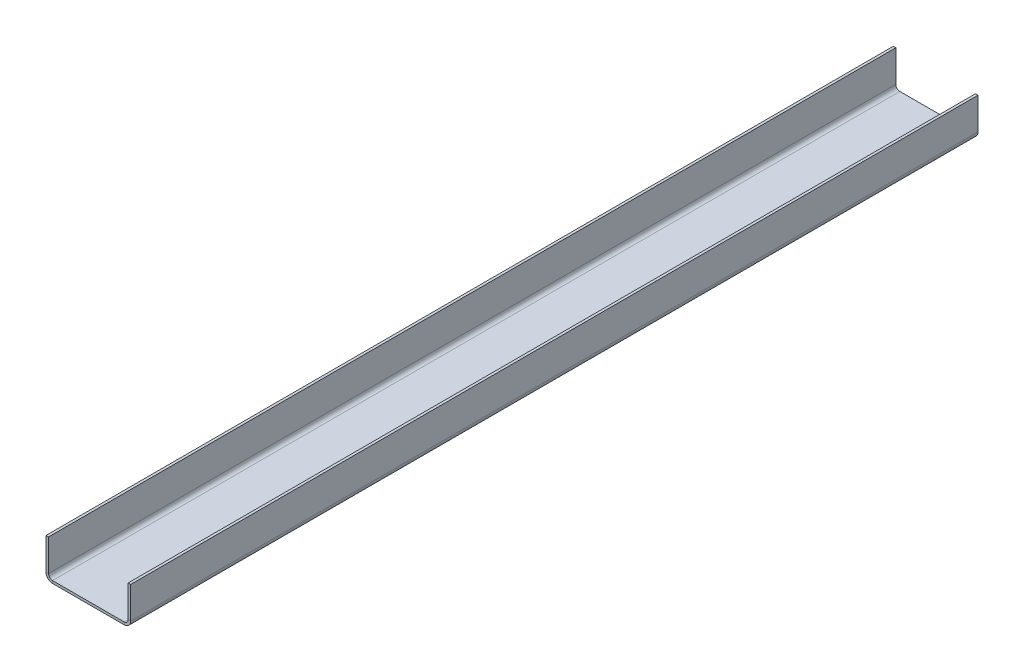
ISO-10303-21;
HEADER;
FILE_DESCRIPTION(('STEP AP214'),'2;1');
FILE_NAME('part.step','',(''),(''),'','','');
FILE_SCHEMA(('AUTOMOTIVE_DESIGN { 1 0 10303 214 1 1 1 1 }'));
ENDSEC;
DATA;
#1=APPLICATION_CONTEXT('core data for automotive mechanical design processes');
#2=APPLICATION_PROTOCOL_DEFINITION('international standard','automotive_design',2000,#1);
#3=PRODUCT_CONTEXT('',#1,'mechanical');
#4=PRODUCT('Part','Part','',(#3));
#5=PRODUCT_RELATED_PRODUCT_CATEGORY('part','',(#4));
#6=PRODUCT_DEFINITION_FORMATION('','',#4);
#7=PRODUCT_DEFINITION_CONTEXT('part definition',#1,'design');
#8=PRODUCT_DEFINITION('design','',#6,#7);
#9=PRODUCT_DEFINITION_SHAPE('','',#8);
#10=(LENGTH_UNIT() NAMED_UNIT(*) SI_UNIT(.MILLI.,.METRE.));
#11=(NAMED_UNIT(*) PLANE_ANGLE_UNIT() SI_UNIT($,.RADIAN.));
#12=(NAMED_UNIT(*) SI_UNIT($,.STERADIAN.) SOLID_ANGLE_UNIT());
#13=UNCERTAINTY_MEASURE_WITH_UNIT(LENGTH_MEASURE(1.E-05),#10,'distance_accuracy_value','');
#14=(GEOMETRIC_REPRESENTATION_CONTEXT(3) GLOBAL_UNCERTAINTY_ASSIGNED_CONTEXT((#13)) GLOBAL_UNIT_ASSIGNED_CONTEXT((#10,
#11,#12)) REPRESENTATION_CONTEXT('',''));
#15=CARTESIAN_POINT('',(0.,0.,0.));
#16=DIRECTION('',(0.,0.,1.));
#17=DIRECTION('',(1.,0.,0.));
#18=AXIS2_PLACEMENT_3D('',#15,#16,#17);
#19=CARTESIAN_POINT('',(0.,3.25,420.));
#20=DIRECTION('',(0.,0.,1.));
#21=DIRECTION('',(1.,0.,0.));
#22=AXIS2_PLACEMENT_3D('',#19,#20,#21);
#23=PLANE('',#22);
#24=DIRECTION('',(1.,0.,0.));
#25=VECTOR('',#24,1.);
#26=CARTESIAN_POINT('',(0.,3.25,420.));
#27=LINE('',#26,#25);
#28=CARTESIAN_POINT('',(0.,3.25,420.));
#29=VERTEX_POINT('',#28);
#30=CARTESIAN_POINT('',(1.25,3.25,420.));
#31=VERTEX_POINT('',#30);
#32=EDGE_CURVE('E11',#29,#31,#27,.T.);
#33=ORIENTED_EDGE('',*,*,#32,.F.);
#34=CARTESIAN_POINT('',(3.25,3.25,420.));
#35=DIRECTION('',(0.,0.,-1.));
#36=DIRECTION('',(-1.,0.,0.));
#37=AXIS2_PLACEMENT_3D('',#34,#35,#36);
#38=CIRCLE('',#37,3.25);
#39=CARTESIAN_POINT('',(3.25,0.,420.));
#40=VERTEX_POINT('',#39);
#41=EDGE_CURVE('E146',#29,#40,#38,.F.);
#42=ORIENTED_EDGE('',*,*,#41,.T.);
#43=DIRECTION('',(0.,-1.,0.));
#44=VECTOR('',#43,1.);
#45=CARTESIAN_POINT('',(3.25,1.25,420.));
#46=LINE('',#45,#44);
#47=CARTESIAN_POINT('',(3.25,1.25,420.));
#48=VERTEX_POINT('',#47);
#49=EDGE_CURVE('E44',#48,#40,#46,.T.);
#50=ORIENTED_EDGE('',*,*,#49,.F.);
#51=CARTESIAN_POINT('',(3.25,3.25,420.));
#52=DIRECTION('',(0.,0.,1.));
#53=DIRECTION('',(1.,0.,0.));
#54=AXIS2_PLACEMENT_3D('',#51,#52,#53);
#55=CIRCLE('',#54,2.);
#56=EDGE_CURVE('E240',#31,#48,#55,.T.);
#57=ORIENTED_EDGE('',*,*,#56,.F.);
#58=EDGE_LOOP('',(#33,#42,#50,#57));
#59=FACE_BOUND('',#58,.T.);
#60=ADVANCED_FACE('F36',(#59),#23,.T.);
#61=CARTESIAN_POINT('',(3.25,1.25,420.));
#62=DIRECTION('',(0.,0.,1.));
#63=DIRECTION('',(1.,0.,0.));
#64=AXIS2_PLACEMENT_3D('',#61,#62,#63);
#65=PLANE('',#64);
#66=DIRECTION('',(0.,-1.,0.));
#67=VECTOR('',#66,1.);
#68=CARTESIAN_POINT('',(0.,19.,420.));
#69=LINE('',#68,#67);
#70=CARTESIAN_POINT('',(0.,19.,420.));
#71=VERTEX_POINT('',#70);
#72=EDGE_CURVE('E151',#71,#29,#69,.T.);
#73=ORIENTED_EDGE('',*,*,#72,.T.);
#74=ORIENTED_EDGE('',*,*,#32,.T.);
#75=DIRECTION('',(0.,-1.,0.));
#76=VECTOR('',#75,1.);
#77=CARTESIAN_POINT('',(1.25,19.,420.));
#78=LINE('',#77,#76);
#79=CARTESIAN_POINT('',(1.25,19.,420.));
#80=VERTEX_POINT('',#79);
#81=EDGE_CURVE('E253',#80,#31,#78,.T.);
#82=ORIENTED_EDGE('',*,*,#81,.F.);
#83=DIRECTION('',(1.,0.,0.));
#84=VECTOR('',#83,1.);
#85=CARTESIAN_POINT('',(0.,19.,420.));
#86=LINE('',#85,#84);
#87=EDGE_CURVE('E255',#71,#80,#86,.T.);
#88=ORIENTED_EDGE('',*,*,#87,.F.);
#89=EDGE_LOOP('',(#73,#74,#82,#88));
#90=FACE_BOUND('',#89,.T.);
#91=ADVANCED_FACE('F266',(#90),#65,.T.);
#92=CARTESIAN_POINT('',(3.25,0.,0.));
#93=DIRECTION('',(0.,0.,-1.));
#94=DIRECTION('',(-1.,0.,0.));
#95=AXIS2_PLACEMENT_3D('',#92,#93,#94);
#96=PLANE('',#95);
#97=DIRECTION('',(0.,1.,0.));
#98=VECTOR('',#97,1.);
#99=CARTESIAN_POINT('',(3.25,0.,0.));
#100=LINE('',#99,#98);
#101=CARTESIAN_POINT('',(3.25,0.,0.));
#102=VERTEX_POINT('',#101);
#103=CARTESIAN_POINT('',(3.25,1.25,0.));
#104=VERTEX_POINT('',#103);
#105=EDGE_CURVE('E144',#102,#104,#100,.T.);
#106=ORIENTED_EDGE('',*,*,#105,.F.);
#107=CARTESIAN_POINT('',(3.25,3.25,0.));
#108=DIRECTION('',(0.,0.,-1.));
#109=DIRECTION('',(-1.,0.,0.));
#110=AXIS2_PLACEMENT_3D('',#107,#108,#109);
#111=CIRCLE('',#110,3.25);
#112=CARTESIAN_POINT('',(0.,3.25,0.));
#113=VERTEX_POINT('',#112);
#114=EDGE_CURVE('E158',#113,#102,#111,.F.);
#115=ORIENTED_EDGE('',*,*,#114,.F.);
#116=DIRECTION('',(-1.,0.,0.));
#117=VECTOR('',#116,1.);
#118=CARTESIAN_POINT('',(1.25,3.25,0.));
#119=LINE('',#118,#117);
#120=CARTESIAN_POINT('',(1.25,3.25,0.));
#121=VERTEX_POINT('',#120);
#122=EDGE_CURVE('E231',#121,#113,#119,.T.);
#123=ORIENTED_EDGE('',*,*,#122,.F.);
#124=CARTESIAN_POINT('',(3.25,3.25,0.));
#125=DIRECTION('',(0.,0.,1.));
#126=DIRECTION('',(1.,0.,0.));
#127=AXIS2_PLACEMENT_3D('',#124,#125,#126);
#128=CIRCLE('',#127,2.);
#129=EDGE_CURVE('E185',#121,#104,#128,.T.);
#130=ORIENTED_EDGE('',*,*,#129,.T.);
#131=EDGE_LOOP('',(#106,#115,#123,#130));
#132=FACE_BOUND('',#131,.T.);
#133=ADVANCED_FACE('F245',(#132),#96,.T.);
#134=CARTESIAN_POINT('',(1.25,3.25,0.));
#135=DIRECTION('',(0.,0.,-1.));
#136=DIRECTION('',(-1.,0.,0.));
#137=AXIS2_PLACEMENT_3D('',#134,#135,#136);
#138=PLANE('',#137);
#139=DIRECTION('',(1.,0.,0.));
#140=VECTOR('',#139,1.);
#141=CARTESIAN_POINT('',(0.,0.,0.));
#142=LINE('',#141,#140);
#143=CARTESIAN_POINT('',(38.75,0.,0.));
#144=VERTEX_POINT('',#143);
#145=EDGE_CURVE('E198',#102,#144,#142,.T.);
#146=ORIENTED_EDGE('',*,*,#145,.F.);
#147=ORIENTED_EDGE('',*,*,#105,.T.);
#148=DIRECTION('',(1.,0.,0.));
#149=VECTOR('',#148,1.);
#150=CARTESIAN_POINT('',(0.,1.25,0.));
#151=LINE('',#150,#149);
#152=CARTESIAN_POINT('',(38.75,1.25,0.));
#153=VERTEX_POINT('',#152);
#154=EDGE_CURVE('E183',#104,#153,#151,.T.);
#155=ORIENTED_EDGE('',*,*,#154,.T.);
#156=DIRECTION('',(0.,-1.,0.));
#157=VECTOR('',#156,1.);
#158=CARTESIAN_POINT('',(38.75,1.25,0.));
#159=LINE('',#158,#157);
#160=EDGE_CURVE('E93',#153,#144,#159,.T.);
#161=ORIENTED_EDGE('',*,*,#160,.T.);
#162=EDGE_LOOP('',(#146,#147,#155,#161));
#163=FACE_BOUND('',#162,.T.);
#164=ADVANCED_FACE('F233',(#163),#138,.T.);
#165=CARTESIAN_POINT('',(38.75,0.,420.));
#166=DIRECTION('',(0.,0.,1.));
#167=DIRECTION('',(1.,0.,0.));
#168=AXIS2_PLACEMENT_3D('',#165,#166,#167);
#169=PLANE('',#168);
#170=DIRECTION('',(0.,1.,0.));
#171=VECTOR('',#170,1.);
#172=CARTESIAN_POINT('',(38.75,0.,420.));
#173=LINE('',#172,#171);
#174=CARTESIAN_POINT('',(38.75,0.,420.));
#175=VERTEX_POINT('',#174);
#176=CARTESIAN_POINT('',(38.75,1.25,420.));
#177=VERTEX_POINT('',#176);
#178=EDGE_CURVE('E229',#175,#177,#173,.T.);
#179=ORIENTED_EDGE('',*,*,#178,.F.);
#180=CARTESIAN_POINT('',(38.75,3.25,420.));
#181=DIRECTION('',(0.,0.,-1.));
#182=DIRECTION('',(-1.,0.,0.));
#183=AXIS2_PLACEMENT_3D('',#180,#181,#182);
#184=CIRCLE('',#183,3.25);
#185=CARTESIAN_POINT('',(42.,3.25,420.));
#186=VERTEX_POINT('',#185);
#187=EDGE_CURVE('E166',#175,#186,#184,.F.);
#188=ORIENTED_EDGE('',*,*,#187,.T.);
#189=DIRECTION('',(1.,0.,0.));
#190=VECTOR('',#189,1.);
#191=CARTESIAN_POINT('',(40.75,3.25,420.));
#192=LINE('',#191,#190);
#193=CARTESIAN_POINT('',(40.75,3.25,420.));
#194=VERTEX_POINT('',#193);
#195=EDGE_CURVE('E52',#194,#186,#192,.T.);
#196=ORIENTED_EDGE('',*,*,#195,.F.);
#197=CARTESIAN_POINT('',(38.75,3.25,420.));
#198=DIRECTION('',(0.,0.,1.));
#199=DIRECTION('',(1.,0.,0.));
#200=AXIS2_PLACEMENT_3D('',#197,#198,#199);
#201=CIRCLE('',#200,2.);
#202=EDGE_CURVE('E257',#177,#194,#201,.T.);
#203=ORIENTED_EDGE('',*,*,#202,.F.);
#204=EDGE_LOOP('',(#179,#188,#196,#203));
#205=FACE_BOUND('',#204,.T.);
#206=ADVANCED_FACE('F292',(#205),#169,.T.);
#207=CARTESIAN_POINT('',(40.75,3.25,420.));
#208=DIRECTION('',(0.,0.,1.));
#209=DIRECTION('',(1.,0.,0.));
#210=AXIS2_PLACEMENT_3D('',#207,#208,#209);
#211=PLANE('',#210);
#212=DIRECTION('',(1.,0.,0.));
#213=VECTOR('',#212,1.);
#214=CARTESIAN_POINT('',(0.,0.,420.));
#215=LINE('',#214,#213);
#216=EDGE_CURVE('E136',#40,#175,#215,.T.);
#217=ORIENTED_EDGE('',*,*,#216,.T.);
#218=ORIENTED_EDGE('',*,*,#178,.T.);
#219=DIRECTION('',(1.,0.,0.));
#220=VECTOR('',#219,1.);
#221=CARTESIAN_POINT('',(0.,1.25,420.));
#222=LINE('',#221,#220);
#223=EDGE_CURVE('E139',#48,#177,#222,.T.);
#224=ORIENTED_EDGE('',*,*,#223,.F.);
#225=ORIENTED_EDGE('',*,*,#49,.T.);
#226=EDGE_LOOP('',(#217,#218,#224,#225));
#227=FACE_BOUND('',#226,.T.);
#228=ADVANCED_FACE('F134',(#227),#211,.T.);
#229=CARTESIAN_POINT('',(42.,3.25,0.));
#230=DIRECTION('',(0.,0.,-1.));
#231=DIRECTION('',(-1.,0.,0.));
#232=AXIS2_PLACEMENT_3D('',#229,#230,#231);
#233=PLANE('',#232);
#234=DIRECTION('',(-1.,0.,0.));
#235=VECTOR('',#234,1.);
#236=CARTESIAN_POINT('',(42.,3.25,0.));
#237=LINE('',#236,#235);
#238=CARTESIAN_POINT('',(42.,3.25,0.));
#239=VERTEX_POINT('',#238);
#240=CARTESIAN_POINT('',(40.75,3.25,0.));
#241=VERTEX_POINT('',#240);
#242=EDGE_CURVE('E100',#239,#241,#237,.T.);
#243=ORIENTED_EDGE('',*,*,#242,.F.);
#244=CARTESIAN_POINT('',(38.75,3.25,0.));
#245=DIRECTION('',(0.,0.,-1.));
#246=DIRECTION('',(-1.,0.,0.));
#247=AXIS2_PLACEMENT_3D('',#244,#245,#246);
#248=CIRCLE('',#247,3.25);
#249=EDGE_CURVE('E200',#144,#239,#248,.F.);
#250=ORIENTED_EDGE('',*,*,#249,.F.);
#251=ORIENTED_EDGE('',*,*,#160,.F.);
#252=CARTESIAN_POINT('',(38.75,3.25,0.));
#253=DIRECTION('',(0.,0.,1.));
#254=DIRECTION('',(1.,0.,0.));
#255=AXIS2_PLACEMENT_3D('',#252,#253,#254);
#256=CIRCLE('',#255,2.);
#257=EDGE_CURVE('E181',#153,#241,#256,.T.);
#258=ORIENTED_EDGE('',*,*,#257,.T.);
#259=EDGE_LOOP('',(#243,#250,#251,#258));
#260=FACE_BOUND('',#259,.T.);
#261=ADVANCED_FACE('F298',(#260),#233,.T.);
#262=CARTESIAN_POINT('',(38.75,1.25,0.));
#263=DIRECTION('',(0.,0.,-1.));
#264=DIRECTION('',(-1.,0.,0.));
#265=AXIS2_PLACEMENT_3D('',#262,#263,#264);
#266=PLANE('',#265);
#267=DIRECTION('',(0.,1.,0.));
#268=VECTOR('',#267,1.);
#269=CARTESIAN_POINT('',(42.,0.,0.));
#270=LINE('',#269,#268);
#271=CARTESIAN_POINT('',(42.,19.,0.));
#272=VERTEX_POINT('',#271);
#273=EDGE_CURVE('E172',#239,#272,#270,.T.);
#274=ORIENTED_EDGE('',*,*,#273,.F.);
#275=ORIENTED_EDGE('',*,*,#242,.T.);
#276=DIRECTION('',(0.,1.,0.));
#277=VECTOR('',#276,1.);
#278=CARTESIAN_POINT('',(40.75,0.,0.));
#279=LINE('',#278,#277);
#280=CARTESIAN_POINT('',(40.75,19.,0.));
#281=VERTEX_POINT('',#280);
#282=EDGE_CURVE('E178',#241,#281,#279,.T.);
#283=ORIENTED_EDGE('',*,*,#282,.T.);
#284=DIRECTION('',(1.,0.,0.));
#285=VECTOR('',#284,1.);
#286=CARTESIAN_POINT('',(40.75,19.,0.));
#287=LINE('',#286,#285);
#288=EDGE_CURVE('E175',#281,#272,#287,.T.);
#289=ORIENTED_EDGE('',*,*,#288,.T.);
#290=EDGE_LOOP('',(#274,#275,#283,#289));
#291=FACE_BOUND('',#290,.T.);
#292=ADVANCED_FACE('F301',(#291),#266,.T.);
#293=CARTESIAN_POINT('',(42.,0.,420.));
#294=DIRECTION('',(-1.,0.,0.));
#295=DIRECTION('',(0.,0.,1.));
#296=AXIS2_PLACEMENT_3D('',#293,#294,#295);
#297=PLANE('',#296);
#298=ORIENTED_EDGE('',*,*,#273,.T.);
#299=DIRECTION('',(0.,0.,-1.));
#300=VECTOR('',#299,1.);
#301=CARTESIAN_POINT('',(42.,19.,420.));
#302=LINE('',#301,#300);
#303=CARTESIAN_POINT('',(42.,19.,420.));
#304=VERTEX_POINT('',#303);
#305=EDGE_CURVE('E224',#304,#272,#302,.T.);
#306=ORIENTED_EDGE('',*,*,#305,.F.);
#307=DIRECTION('',(0.,1.,0.));
#308=VECTOR('',#307,1.);
#309=CARTESIAN_POINT('',(42.,0.,420.));
#310=LINE('',#309,#308);
#311=EDGE_CURVE('E106',#186,#304,#310,.T.);
#312=ORIENTED_EDGE('',*,*,#311,.F.);
#313=DIRECTION('',(0.,0.,-1.));
#314=VECTOR('',#313,1.);
#315=CARTESIAN_POINT('',(42.,3.25,420.));
#316=LINE('',#315,#314);
#317=EDGE_CURVE('E168',#186,#239,#316,.T.);
#318=ORIENTED_EDGE('',*,*,#317,.T.);
#319=EDGE_LOOP('',(#298,#306,#312,#318));
#320=FACE_BOUND('',#319,.T.);
#321=ADVANCED_FACE('F304',(#320),#297,.F.);
#322=CARTESIAN_POINT('',(40.75,19.,420.));
#323=DIRECTION('',(0.,1.,0.));
#324=DIRECTION('',(0.,0.,1.));
#325=AXIS2_PLACEMENT_3D('',#322,#323,#324);
#326=PLANE('',#325);
#327=ORIENTED_EDGE('',*,*,#288,.F.);
#328=DIRECTION('',(0.,0.,-1.));
#329=VECTOR('',#328,1.);
#330=CARTESIAN_POINT('',(40.75,19.,420.));
#331=LINE('',#330,#329);
#332=CARTESIAN_POINT('',(40.75,19.,420.));
#333=VERTEX_POINT('',#332);
#334=EDGE_CURVE('E222',#333,#281,#331,.T.);
#335=ORIENTED_EDGE('',*,*,#334,.F.);
#336=DIRECTION('',(1.,0.,0.));
#337=VECTOR('',#336,1.);
#338=CARTESIAN_POINT('',(40.75,19.,420.));
#339=LINE('',#338,#337);
#340=EDGE_CURVE('E512',#333,#304,#339,.T.);
#341=ORIENTED_EDGE('',*,*,#340,.T.);
#342=ORIENTED_EDGE('',*,*,#305,.T.);
#343=EDGE_LOOP('',(#327,#335,#341,#342));
#344=FACE_BOUND('',#343,.T.);
#345=ADVANCED_FACE('F308',(#344),#326,.T.);
#346=CARTESIAN_POINT('',(40.75,0.,420.));
#347=DIRECTION('',(-1.,0.,0.));
#348=DIRECTION('',(0.,0.,1.));
#349=AXIS2_PLACEMENT_3D('',#346,#347,#348);
#350=PLANE('',#349);
#351=ORIENTED_EDGE('',*,*,#282,.F.);
#352=DIRECTION('',(0.,0.,-1.));
#353=VECTOR('',#352,1.);
#354=CARTESIAN_POINT('',(40.75,3.25,420.));
#355=LINE('',#354,#353);
#356=EDGE_CURVE('E219',#194,#241,#355,.T.);
#357=ORIENTED_EDGE('',*,*,#356,.F.);
#358=DIRECTION('',(0.,1.,0.));
#359=VECTOR('',#358,1.);
#360=CARTESIAN_POINT('',(40.75,0.,420.));
#361=LINE('',#360,#359);
#362=EDGE_CURVE('E514',#194,#333,#361,.T.);
#363=ORIENTED_EDGE('',*,*,#362,.T.);
#364=ORIENTED_EDGE('',*,*,#334,.T.);
#365=EDGE_LOOP('',(#351,#357,#363,#364));
#366=FACE_BOUND('',#365,.T.);
#367=ADVANCED_FACE('F312',(#366),#350,.T.);
#368=CARTESIAN_POINT('',(38.75,3.25,420.));
#369=DIRECTION('',(0.,0.,-1.));
#370=DIRECTION('',(-1.,0.,0.));
#371=AXIS2_PLACEMENT_3D('',#368,#369,#370);
#372=CYLINDRICAL_SURFACE('',#371,2.);
#373=ORIENTED_EDGE('',*,*,#257,.F.);
#374=DIRECTION('',(0.,0.,-1.));
#375=VECTOR('',#374,1.);
#376=CARTESIAN_POINT('',(38.75,1.25,420.));
#377=LINE('',#376,#375);
#378=EDGE_CURVE('E216',#177,#153,#377,.T.);
#379=ORIENTED_EDGE('',*,*,#378,.F.);
#380=ORIENTED_EDGE('',*,*,#202,.T.);
#381=ORIENTED_EDGE('',*,*,#356,.T.);
#382=EDGE_LOOP('',(#373,#379,#380,#381));
#383=FACE_BOUND('',#382,.T.);
#384=ADVANCED_FACE('F316',(#383),#372,.F.);
#385=CARTESIAN_POINT('',(0.,1.25,420.));
#386=DIRECTION('',(0.,1.,0.));
#387=DIRECTION('',(0.,0.,1.));
#388=AXIS2_PLACEMENT_3D('',#385,#386,#387);
#389=PLANE('',#388);
#390=ORIENTED_EDGE('',*,*,#154,.F.);
#391=DIRECTION('',(0.,0.,-1.));
#392=VECTOR('',#391,1.);
#393=CARTESIAN_POINT('',(3.25,1.25,420.));
#394=LINE('',#393,#392);
#395=EDGE_CURVE('E213',#48,#104,#394,.T.);
#396=ORIENTED_EDGE('',*,*,#395,.F.);
#397=ORIENTED_EDGE('',*,*,#223,.T.);
#398=ORIENTED_EDGE('',*,*,#378,.T.);
#399=EDGE_LOOP('',(#390,#396,#397,#398));
#400=FACE_BOUND('',#399,.T.);
#401=ADVANCED_FACE('F242',(#400),#389,.T.);
#402=CARTESIAN_POINT('',(3.25,3.25,420.));
#403=DIRECTION('',(0.,0.,-1.));
#404=DIRECTION('',(-1.,0.,0.));
#405=AXIS2_PLACEMENT_3D('',#402,#403,#404);
#406=CYLINDRICAL_SURFACE('',#405,2.);
#407=ORIENTED_EDGE('',*,*,#129,.F.);
#408=DIRECTION('',(0.,0.,-1.));
#409=VECTOR('',#408,1.);
#410=CARTESIAN_POINT('',(1.25,3.25,420.));
#411=LINE('',#410,#409);
#412=EDGE_CURVE('E210',#31,#121,#411,.T.);
#413=ORIENTED_EDGE('',*,*,#412,.F.);
#414=ORIENTED_EDGE('',*,*,#56,.T.);
#415=ORIENTED_EDGE('',*,*,#395,.T.);
#416=EDGE_LOOP('',(#407,#413,#414,#415));
#417=FACE_BOUND('',#416,.T.);
#418=ADVANCED_FACE('F238',(#417),#406,.F.);
#419=CARTESIAN_POINT('',(1.25,19.,420.));
#420=DIRECTION('',(1.,0.,0.));
#421=DIRECTION('',(0.,1.,0.));
#422=AXIS2_PLACEMENT_3D('',#419,#420,#421);
#423=PLANE('',#422);
#424=DIRECTION('',(0.,-1.,0.));
#425=VECTOR('',#424,1.);
#426=CARTESIAN_POINT('',(1.25,19.,0.));
#427=LINE('',#426,#425);
#428=CARTESIAN_POINT('',(1.25,19.,0.));
#429=VERTEX_POINT('',#428);
#430=EDGE_CURVE('E188',#429,#121,#427,.T.);
#431=ORIENTED_EDGE('',*,*,#430,.F.);
#432=DIRECTION('',(0.,0.,-1.));
#433=VECTOR('',#432,1.);
#434=CARTESIAN_POINT('',(1.25,19.,420.));
#435=LINE('',#434,#433);
#436=EDGE_CURVE('E208',#80,#429,#435,.T.);
#437=ORIENTED_EDGE('',*,*,#436,.F.);
#438=ORIENTED_EDGE('',*,*,#81,.T.);
#439=ORIENTED_EDGE('',*,*,#412,.T.);
#440=EDGE_LOOP('',(#431,#437,#438,#439));
#441=FACE_BOUND('',#440,.T.);
#442=ADVANCED_FACE('F251',(#441),#423,.T.);
#443=CARTESIAN_POINT('',(0.,19.,420.));
#444=DIRECTION('',(0.,1.,0.));
#445=DIRECTION('',(0.,0.,1.));
#446=AXIS2_PLACEMENT_3D('',#443,#444,#445);
#447=PLANE('',#446);
#448=DIRECTION('',(1.,0.,0.));
#449=VECTOR('',#448,1.);
#450=CARTESIAN_POINT('',(0.,19.,0.));
#451=LINE('',#450,#449);
#452=CARTESIAN_POINT('',(0.,19.,0.));
#453=VERTEX_POINT('',#452);
#454=EDGE_CURVE('E191',#453,#429,#451,.T.);
#455=ORIENTED_EDGE('',*,*,#454,.F.);
#456=DIRECTION('',(0.,0.,-1.));
#457=VECTOR('',#456,1.);
#458=CARTESIAN_POINT('',(0.,19.,420.));
#459=LINE('',#458,#457);
#460=EDGE_CURVE('E206',#71,#453,#459,.T.);
#461=ORIENTED_EDGE('',*,*,#460,.F.);
#462=ORIENTED_EDGE('',*,*,#87,.T.);
#463=ORIENTED_EDGE('',*,*,#436,.T.);
#464=EDGE_LOOP('',(#455,#461,#462,#463));
#465=FACE_BOUND('',#464,.T.);
#466=ADVANCED_FACE('F272',(#465),#447,.T.);
#467=CARTESIAN_POINT('',(0.,19.,420.));
#468=DIRECTION('',(1.,0.,0.));
#469=DIRECTION('',(0.,1.,0.));
#470=AXIS2_PLACEMENT_3D('',#467,#468,#469);
#471=PLANE('',#470);
#472=DIRECTION('',(0.,-1.,0.));
#473=VECTOR('',#472,1.);
#474=CARTESIAN_POINT('',(0.,19.,0.));
#475=LINE('',#474,#473);
#476=EDGE_CURVE('E194',#453,#113,#475,.T.);
#477=ORIENTED_EDGE('',*,*,#476,.T.);
#478=DIRECTION('',(0.,0.,-1.));
#479=VECTOR('',#478,1.);
#480=CARTESIAN_POINT('',(0.,3.25,420.));
#481=LINE('',#480,#479);
#482=EDGE_CURVE('E160',#29,#113,#481,.T.);
#483=ORIENTED_EDGE('',*,*,#482,.F.);
#484=ORIENTED_EDGE('',*,*,#72,.F.);
#485=ORIENTED_EDGE('',*,*,#460,.T.);
#486=EDGE_LOOP('',(#477,#483,#484,#485));
#487=FACE_BOUND('',#486,.T.);
#488=ADVANCED_FACE('F268',(#487),#471,.F.);
#489=CARTESIAN_POINT('',(3.25,3.25,420.));
#490=DIRECTION('',(0.,0.,-1.));
#491=DIRECTION('',(-1.,0.,0.));
#492=AXIS2_PLACEMENT_3D('',#489,#490,#491);
#493=CYLINDRICAL_SURFACE('',#492,3.25);
#494=ORIENTED_EDGE('',*,*,#114,.T.);
#495=DIRECTION('',(0.,0.,-1.));
#496=VECTOR('',#495,1.);
#497=CARTESIAN_POINT('',(3.25,0.,420.));
#498=LINE('',#497,#496);
#499=EDGE_CURVE('E155',#40,#102,#498,.T.);
#500=ORIENTED_EDGE('',*,*,#499,.F.);
#501=ORIENTED_EDGE('',*,*,#41,.F.);
#502=ORIENTED_EDGE('',*,*,#482,.T.);
#503=EDGE_LOOP('',(#494,#500,#501,#502));
#504=FACE_BOUND('',#503,.T.);
#505=ADVANCED_FACE('F156',(#504),#493,.T.);
#506=CARTESIAN_POINT('',(0.,0.,420.));
#507=DIRECTION('',(0.,1.,0.));
#508=DIRECTION('',(0.,0.,1.));
#509=AXIS2_PLACEMENT_3D('',#506,#507,#508);
#510=PLANE('',#509);
#511=ORIENTED_EDGE('',*,*,#145,.T.);
#512=DIRECTION('',(0.,0.,-1.));
#513=VECTOR('',#512,1.);
#514=CARTESIAN_POINT('',(38.75,0.,420.));
#515=LINE('',#514,#513);
#516=EDGE_CURVE('E161',#175,#144,#515,.T.);
#517=ORIENTED_EDGE('',*,*,#516,.F.);
#518=ORIENTED_EDGE('',*,*,#216,.F.);
#519=ORIENTED_EDGE('',*,*,#499,.T.);
#520=EDGE_LOOP('',(#511,#517,#518,#519));
#521=FACE_BOUND('',#520,.T.);
#522=ADVANCED_FACE('F163',(#521),#510,.F.);
#523=CARTESIAN_POINT('',(38.75,3.25,420.));
#524=DIRECTION('',(0.,0.,-1.));
#525=DIRECTION('',(-1.,0.,0.));
#526=AXIS2_PLACEMENT_3D('',#523,#524,#525);
#527=CYLINDRICAL_SURFACE('',#526,3.25);
#528=ORIENTED_EDGE('',*,*,#249,.T.);
#529=ORIENTED_EDGE('',*,*,#317,.F.);
#530=ORIENTED_EDGE('',*,*,#187,.F.);
#531=ORIENTED_EDGE('',*,*,#516,.T.);
#532=EDGE_LOOP('',(#528,#529,#530,#531));
#533=FACE_BOUND('',#532,.T.);
#534=ADVANCED_FACE('F363',(#533),#527,.T.);
#535=CARTESIAN_POINT('',(38.75,3.25,420.));
#536=DIRECTION('',(0.,0.,1.));
#537=DIRECTION('',(1.,0.,0.));
#538=AXIS2_PLACEMENT_3D('',#535,#536,#537);
#539=PLANE('',#538);
#540=ORIENTED_EDGE('',*,*,#311,.T.);
#541=ORIENTED_EDGE('',*,*,#340,.F.);
#542=ORIENTED_EDGE('',*,*,#362,.F.);
#543=ORIENTED_EDGE('',*,*,#195,.T.);
#544=EDGE_LOOP('',(#540,#541,#542,#543));
#545=FACE_BOUND('',#544,.T.);
#546=ADVANCED_FACE('F373',(#545),#539,.T.);
#547=CARTESIAN_POINT('',(38.75,3.25,0.));
#548=DIRECTION('',(0.,0.,1.));
#549=DIRECTION('',(1.,0.,0.));
#550=AXIS2_PLACEMENT_3D('',#547,#548,#549);
#551=PLANE('',#550);
#552=ORIENTED_EDGE('',*,*,#430,.T.);
#553=ORIENTED_EDGE('',*,*,#122,.T.);
#554=ORIENTED_EDGE('',*,*,#476,.F.);
#555=ORIENTED_EDGE('',*,*,#454,.T.);
#556=EDGE_LOOP('',(#552,#553,#554,#555));
#557=FACE_BOUND('',#556,.T.);
#558=ADVANCED_FACE('F270',(#557),#551,.F.);
#559=CLOSED_SHELL('',(#60,#91,#133,#164,#206,#228,#261,#292,#321,#345,#367,#384,#401,#418,#442,
#466,#488,#505,#522,#534,#546,#558));
#560=MANIFOLD_SOLID_BREP('B2',#559);
#561=ADVANCED_BREP_SHAPE_REPRESENTATION('',(#18,#560),#14);
#562=SHAPE_DEFINITION_REPRESENTATION(#9,#561);
ENDSEC;
END-ISO-10303-21;
